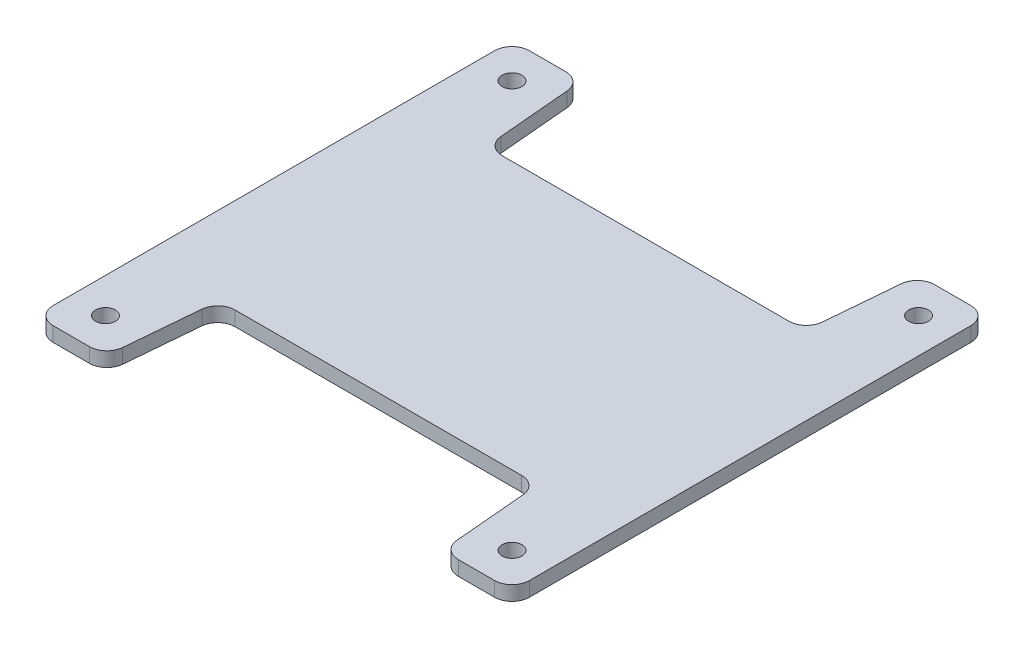
ISO-10303-21;
HEADER;
FILE_DESCRIPTION(('STEP AP214'),'2;1');
FILE_NAME('part.step','',(''),(''),'','','');
FILE_SCHEMA(('AUTOMOTIVE_DESIGN { 1 0 10303 214 1 1 1 1 }'));
ENDSEC;
DATA;
#1=APPLICATION_CONTEXT('core data for automotive mechanical design processes');
#2=APPLICATION_PROTOCOL_DEFINITION('international standard','automotive_design',2000,#1);
#3=PRODUCT_CONTEXT('',#1,'mechanical');
#4=PRODUCT('Part','Part','',(#3));
#5=PRODUCT_RELATED_PRODUCT_CATEGORY('part','',(#4));
#6=PRODUCT_DEFINITION_FORMATION('','',#4);
#7=PRODUCT_DEFINITION_CONTEXT('part definition',#1,'design');
#8=PRODUCT_DEFINITION('design','',#6,#7);
#9=PRODUCT_DEFINITION_SHAPE('','',#8);
#10=(LENGTH_UNIT() NAMED_UNIT(*) SI_UNIT(.MILLI.,.METRE.));
#11=(NAMED_UNIT(*) PLANE_ANGLE_UNIT() SI_UNIT($,.RADIAN.));
#12=(NAMED_UNIT(*) SI_UNIT($,.STERADIAN.) SOLID_ANGLE_UNIT());
#13=UNCERTAINTY_MEASURE_WITH_UNIT(LENGTH_MEASURE(1.E-05),#10,'distance_accuracy_value','');
#14=(GEOMETRIC_REPRESENTATION_CONTEXT(3) GLOBAL_UNCERTAINTY_ASSIGNED_CONTEXT((#13)) GLOBAL_UNIT_ASSIGNED_CONTEXT((#10,
#11,#12)) REPRESENTATION_CONTEXT('',''));
#15=CARTESIAN_POINT('',(0.,0.,0.));
#16=DIRECTION('',(0.,0.,1.));
#17=DIRECTION('',(1.,0.,0.));
#18=AXIS2_PLACEMENT_3D('',#15,#16,#17);
#19=CARTESIAN_POINT('',(-41.,1.25,41.));
#20=DIRECTION('',(0.,0.,-1.));
#21=DIRECTION('',(-1.,0.,0.));
#22=AXIS2_PLACEMENT_3D('',#19,#20,#21);
#23=PLANE('',#22);
#24=DIRECTION('',(1.,0.,0.));
#25=VECTOR('',#24,1.);
#26=CARTESIAN_POINT('',(-41.,1.25,41.));
#27=LINE('',#26,#25);
#28=CARTESIAN_POINT('',(31.7489935220523,1.25,41.));
#29=VERTEX_POINT('',#28);
#30=CARTESIAN_POINT('',(38.,1.25,41.));
#31=VERTEX_POINT('',#30);
#32=EDGE_CURVE('E458',#29,#31,#27,.T.);
#33=ORIENTED_EDGE('',*,*,#32,.F.);
#34=DIRECTION('',(0.,-1.,0.));
#35=VECTOR('',#34,1.);
#36=CARTESIAN_POINT('',(31.7489935220523,-1.25,41.));
#37=LINE('',#36,#35);
#38=CARTESIAN_POINT('',(31.7489935220523,-1.25,41.));
#39=VERTEX_POINT('',#38);
#40=EDGE_CURVE('E337',#29,#39,#37,.T.);
#41=ORIENTED_EDGE('',*,*,#40,.T.);
#42=DIRECTION('',(1.,0.,0.));
#43=VECTOR('',#42,1.);
#44=CARTESIAN_POINT('',(-41.,-1.25,41.));
#45=LINE('',#44,#43);
#46=CARTESIAN_POINT('',(38.,-1.25,41.));
#47=VERTEX_POINT('',#46);
#48=EDGE_CURVE('E469',#39,#47,#45,.T.);
#49=ORIENTED_EDGE('',*,*,#48,.T.);
#50=DIRECTION('',(0.,-1.,0.));
#51=VECTOR('',#50,1.);
#52=CARTESIAN_POINT('',(38.,1.25,41.));
#53=LINE('',#52,#51);
#54=EDGE_CURVE('E334',#47,#31,#53,.F.);
#55=ORIENTED_EDGE('',*,*,#54,.T.);
#56=EDGE_LOOP('',(#33,#41,#49,#55));
#57=FACE_BOUND('',#56,.T.);
#58=ADVANCED_FACE('F43',(#57),#23,.F.);
#59=CARTESIAN_POINT('',(-41.,1.25,-41.));
#60=DIRECTION('',(0.,0.,1.));
#61=DIRECTION('',(1.,0.,0.));
#62=AXIS2_PLACEMENT_3D('',#59,#60,#61);
#63=PLANE('',#62);
#64=DIRECTION('',(-1.,0.,0.));
#65=VECTOR('',#64,1.);
#66=CARTESIAN_POINT('',(-41.,1.25,-41.));
#67=LINE('',#66,#65);
#68=CARTESIAN_POINT('',(-31.7489935220523,1.25,-41.));
#69=VERTEX_POINT('',#68);
#70=CARTESIAN_POINT('',(-38.,1.25,-41.));
#71=VERTEX_POINT('',#70);
#72=EDGE_CURVE('E240',#69,#71,#67,.T.);
#73=ORIENTED_EDGE('',*,*,#72,.F.);
#74=DIRECTION('',(0.,-1.,0.));
#75=VECTOR('',#74,1.);
#76=CARTESIAN_POINT('',(-31.7489935220523,-1.25,-41.));
#77=LINE('',#76,#75);
#78=CARTESIAN_POINT('',(-31.7489935220523,-1.25,-41.));
#79=VERTEX_POINT('',#78);
#80=EDGE_CURVE('E255',#69,#79,#77,.T.);
#81=ORIENTED_EDGE('',*,*,#80,.T.);
#82=DIRECTION('',(-1.,0.,0.));
#83=VECTOR('',#82,1.);
#84=CARTESIAN_POINT('',(-41.,-1.25,-41.));
#85=LINE('',#84,#83);
#86=CARTESIAN_POINT('',(-38.,-1.25,-41.));
#87=VERTEX_POINT('',#86);
#88=EDGE_CURVE('E476',#79,#87,#85,.T.);
#89=ORIENTED_EDGE('',*,*,#88,.T.);
#90=DIRECTION('',(0.,-1.,0.));
#91=VECTOR('',#90,1.);
#92=CARTESIAN_POINT('',(-38.,1.25,-41.));
#93=LINE('',#92,#91);
#94=EDGE_CURVE('E252',#87,#71,#93,.F.);
#95=ORIENTED_EDGE('',*,*,#94,.T.);
#96=EDGE_LOOP('',(#73,#81,#89,#95));
#97=FACE_BOUND('',#96,.T.);
#98=ADVANCED_FACE('F530',(#97),#63,.F.);
#99=CARTESIAN_POINT('',(0.,1.25,0.));
#100=DIRECTION('',(0.,1.,0.));
#101=DIRECTION('',(0.,0.,1.));
#102=AXIS2_PLACEMENT_3D('',#99,#100,#101);
#103=PLANE('',#102);
#104=CARTESIAN_POINT('',(35.,1.25,-35.));
#105=DIRECTION('',(0.,1.,0.));
#106=DIRECTION('',(0.,0.,1.));
#107=AXIS2_PLACEMENT_3D('',#104,#105,#106);
#108=CIRCLE('',#107,1.69999999999999);
#109=CARTESIAN_POINT('',(35.,1.25,-33.3));
#110=VERTEX_POINT('',#109);
#111=EDGE_CURVE('E421',#110,#110,#108,.T.);
#112=ORIENTED_EDGE('',*,*,#111,.F.);
#113=EDGE_LOOP('',(#112));
#114=FACE_BOUND('',#113,.T.);
#115=CARTESIAN_POINT('',(-35.,1.25,35.));
#116=DIRECTION('',(0.,1.,0.));
#117=DIRECTION('',(0.,0.,1.));
#118=AXIS2_PLACEMENT_3D('',#115,#116,#117);
#119=CIRCLE('',#118,1.69999999999999);
#120=CARTESIAN_POINT('',(-35.,1.25,36.7));
#121=VERTEX_POINT('',#120);
#122=EDGE_CURVE('E430',#121,#121,#119,.T.);
#123=ORIENTED_EDGE('',*,*,#122,.F.);
#124=EDGE_LOOP('',(#123));
#125=FACE_BOUND('',#124,.T.);
#126=CARTESIAN_POINT('',(-35.,1.25,-35.));
#127=DIRECTION('',(0.,1.,0.));
#128=DIRECTION('',(0.,0.,1.));
#129=AXIS2_PLACEMENT_3D('',#126,#127,#128);
#130=CIRCLE('',#129,1.69999999999999);
#131=CARTESIAN_POINT('',(-35.,1.25,-33.3));
#132=VERTEX_POINT('',#131);
#133=EDGE_CURVE('E438',#132,#132,#130,.T.);
#134=ORIENTED_EDGE('',*,*,#133,.F.);
#135=EDGE_LOOP('',(#134));
#136=FACE_BOUND('',#135,.T.);
#137=CARTESIAN_POINT('',(35.,1.25,35.));
#138=DIRECTION('',(0.,1.,0.));
#139=DIRECTION('',(0.,0.,1.));
#140=AXIS2_PLACEMENT_3D('',#137,#138,#139);
#141=CIRCLE('',#140,1.69999999999999);
#142=CARTESIAN_POINT('',(35.,1.25,36.7));
#143=VERTEX_POINT('',#142);
#144=EDGE_CURVE('E446',#143,#143,#141,.T.);
#145=ORIENTED_EDGE('',*,*,#144,.F.);
#146=EDGE_LOOP('',(#145));
#147=FACE_BOUND('',#146,.T.);
#148=DIRECTION('',(0.0871557427476557,0.,0.996194698091746));
#149=VECTOR('',#148,1.);
#150=CARTESIAN_POINT('',(-25.2199247765051,1.25,2.2064575129207));
#151=LINE('',#150,#149);
#152=CARTESIAN_POINT('',(-28.7604094277771,1.25,-38.261467228243));
#153=VERTEX_POINT('',#152);
#154=CARTESIAN_POINT('',(-27.6647946287564,1.25,-25.738532771757));
#155=VERTEX_POINT('',#154);
#156=EDGE_CURVE('E416',#153,#155,#151,.T.);
#157=ORIENTED_EDGE('',*,*,#156,.F.);
#158=CARTESIAN_POINT('',(-31.7489935220523,1.25,-38.));
#159=DIRECTION('',(0.,1.,0.));
#160=DIRECTION('',(0.,0.,1.));
#161=AXIS2_PLACEMENT_3D('',#158,#159,#160);
#162=CIRCLE('',#161,3.);
#163=EDGE_CURVE('E310',#153,#69,#162,.T.);
#164=ORIENTED_EDGE('',*,*,#163,.T.);
#165=ORIENTED_EDGE('',*,*,#72,.T.);
#166=CARTESIAN_POINT('',(-38.,1.25,-38.));
#167=DIRECTION('',(0.,1.,0.));
#168=DIRECTION('',(0.,0.,1.));
#169=AXIS2_PLACEMENT_3D('',#166,#167,#168);
#170=CIRCLE('',#169,3.);
#171=CARTESIAN_POINT('',(-41.,1.25,-38.));
#172=VERTEX_POINT('',#171);
#173=EDGE_CURVE('E295',#71,#172,#170,.T.);
#174=ORIENTED_EDGE('',*,*,#173,.T.);
#175=DIRECTION('',(0.,0.,1.));
#176=VECTOR('',#175,1.);
#177=CARTESIAN_POINT('',(-41.,1.25,-41.));
#178=LINE('',#177,#176);
#179=CARTESIAN_POINT('',(-41.,1.25,38.));
#180=VERTEX_POINT('',#179);
#181=EDGE_CURVE('E455',#172,#180,#178,.T.);
#182=ORIENTED_EDGE('',*,*,#181,.T.);
#183=CARTESIAN_POINT('',(-38.,1.25,38.));
#184=DIRECTION('',(0.,1.,0.));
#185=DIRECTION('',(0.,0.,1.));
#186=AXIS2_PLACEMENT_3D('',#183,#184,#185);
#187=CIRCLE('',#186,3.);
#188=CARTESIAN_POINT('',(-38.,1.25,41.));
#189=VERTEX_POINT('',#188);
#190=EDGE_CURVE('E66',#180,#189,#187,.T.);
#191=ORIENTED_EDGE('',*,*,#190,.T.);
#192=CARTESIAN_POINT('',(-31.7489935220523,1.25,41.));
#193=VERTEX_POINT('',#192);
#194=EDGE_CURVE('E459',#189,#193,#27,.T.);
#195=ORIENTED_EDGE('',*,*,#194,.T.);
#196=CARTESIAN_POINT('',(-31.7489935220523,1.25,38.));
#197=DIRECTION('',(0.,1.,0.));
#198=DIRECTION('',(0.,0.,1.));
#199=AXIS2_PLACEMENT_3D('',#196,#197,#198);
#200=CIRCLE('',#199,3.);
#201=CARTESIAN_POINT('',(-28.7604094277771,1.25,38.261467228243));
#202=VERTEX_POINT('',#201);
#203=EDGE_CURVE('E301',#193,#202,#200,.T.);
#204=ORIENTED_EDGE('',*,*,#203,.T.);
#205=DIRECTION('',(0.0871557427476557,0.,-0.996194698091746));
#206=VECTOR('',#205,1.);
#207=CARTESIAN_POINT('',(-25.2199247765051,1.25,-2.2064575129207));
#208=LINE('',#207,#206);
#209=CARTESIAN_POINT('',(-27.6647946287564,1.25,25.738532771757));
#210=VERTEX_POINT('',#209);
#211=EDGE_CURVE('E492',#202,#210,#208,.T.);
#212=ORIENTED_EDGE('',*,*,#211,.T.);
#213=CARTESIAN_POINT('',(-24.6762105344812,1.25,26.));
#214=DIRECTION('',(0.,1.,0.));
#215=DIRECTION('',(0.,0.,1.));
#216=AXIS2_PLACEMENT_3D('',#213,#214,#215);
#217=CIRCLE('',#216,3.);
#218=CARTESIAN_POINT('',(-24.6762105344812,1.25,23.));
#219=VERTEX_POINT('',#218);
#220=EDGE_CURVE('E370',#210,#219,#217,.F.);
#221=ORIENTED_EDGE('',*,*,#220,.T.);
#222=DIRECTION('',(-1.,0.,0.));
#223=VECTOR('',#222,1.);
#224=CARTESIAN_POINT('',(0.,1.25,23.));
#225=LINE('',#224,#223);
#226=CARTESIAN_POINT('',(24.6762105344812,1.25,23.));
#227=VERTEX_POINT('',#226);
#228=EDGE_CURVE('E426',#227,#219,#225,.T.);
#229=ORIENTED_EDGE('',*,*,#228,.F.);
#230=CARTESIAN_POINT('',(24.6762105344812,1.25,26.));
#231=DIRECTION('',(0.,1.,0.));
#232=DIRECTION('',(0.,0.,1.));
#233=AXIS2_PLACEMENT_3D('',#230,#231,#232);
#234=CIRCLE('',#233,3.);
#235=CARTESIAN_POINT('',(27.6647946287564,1.25,25.738532771757));
#236=VERTEX_POINT('',#235);
#237=EDGE_CURVE('E11',#227,#236,#234,.F.);
#238=ORIENTED_EDGE('',*,*,#237,.T.);
#239=DIRECTION('',(-0.0871557427476557,0.,-0.996194698091746));
#240=VECTOR('',#239,1.);
#241=CARTESIAN_POINT('',(25.2199247765051,1.25,-2.2064575129207));
#242=LINE('',#241,#240);
#243=CARTESIAN_POINT('',(28.7604094277771,1.25,38.261467228243));
#244=VERTEX_POINT('',#243);
#245=EDGE_CURVE('E227',#244,#236,#242,.T.);
#246=ORIENTED_EDGE('',*,*,#245,.F.);
#247=CARTESIAN_POINT('',(31.7489935220523,1.25,38.));
#248=DIRECTION('',(0.,1.,0.));
#249=DIRECTION('',(0.,0.,1.));
#250=AXIS2_PLACEMENT_3D('',#247,#248,#249);
#251=CIRCLE('',#250,3.);
#252=EDGE_CURVE('E304',#244,#29,#251,.T.);
#253=ORIENTED_EDGE('',*,*,#252,.T.);
#254=ORIENTED_EDGE('',*,*,#32,.T.);
#255=CARTESIAN_POINT('',(38.,1.25,38.));
#256=DIRECTION('',(0.,1.,0.));
#257=DIRECTION('',(0.,0.,1.));
#258=AXIS2_PLACEMENT_3D('',#255,#256,#257);
#259=CIRCLE('',#258,3.);
#260=CARTESIAN_POINT('',(41.,1.25,38.));
#261=VERTEX_POINT('',#260);
#262=EDGE_CURVE('E290',#31,#261,#259,.T.);
#263=ORIENTED_EDGE('',*,*,#262,.T.);
#264=DIRECTION('',(0.,0.,-1.));
#265=VECTOR('',#264,1.);
#266=CARTESIAN_POINT('',(41.,1.25,-41.));
#267=LINE('',#266,#265);
#268=CARTESIAN_POINT('',(41.,1.25,-38.));
#269=VERTEX_POINT('',#268);
#270=EDGE_CURVE('E462',#261,#269,#267,.T.);
#271=ORIENTED_EDGE('',*,*,#270,.T.);
#272=CARTESIAN_POINT('',(38.,1.25,-38.));
#273=DIRECTION('',(0.,1.,0.));
#274=DIRECTION('',(0.,0.,1.));
#275=AXIS2_PLACEMENT_3D('',#272,#273,#274);
#276=CIRCLE('',#275,3.);
#277=CARTESIAN_POINT('',(38.,1.25,-41.));
#278=VERTEX_POINT('',#277);
#279=EDGE_CURVE('E298',#269,#278,#276,.T.);
#280=ORIENTED_EDGE('',*,*,#279,.T.);
#281=CARTESIAN_POINT('',(31.7489935220523,1.25,-41.));
#282=VERTEX_POINT('',#281);
#283=EDGE_CURVE('E233',#278,#282,#67,.T.);
#284=ORIENTED_EDGE('',*,*,#283,.T.);
#285=CARTESIAN_POINT('',(31.7489935220523,1.25,-38.));
#286=DIRECTION('',(0.,1.,0.));
#287=DIRECTION('',(0.,0.,1.));
#288=AXIS2_PLACEMENT_3D('',#285,#286,#287);
#289=CIRCLE('',#288,3.);
#290=CARTESIAN_POINT('',(28.7604094277771,1.25,-38.261467228243));
#291=VERTEX_POINT('',#290);
#292=EDGE_CURVE('E307',#282,#291,#289,.T.);
#293=ORIENTED_EDGE('',*,*,#292,.T.);
#294=DIRECTION('',(-0.0871557427476557,0.,0.996194698091746));
#295=VECTOR('',#294,1.);
#296=CARTESIAN_POINT('',(25.2199247765051,1.25,2.2064575129207));
#297=LINE('',#296,#295);
#298=CARTESIAN_POINT('',(27.6647946287564,1.25,-25.738532771757));
#299=VERTEX_POINT('',#298);
#300=EDGE_CURVE('E392',#291,#299,#297,.T.);
#301=ORIENTED_EDGE('',*,*,#300,.T.);
#302=CARTESIAN_POINT('',(24.6762105344812,1.25,-26.));
#303=DIRECTION('',(0.,1.,0.));
#304=DIRECTION('',(0.,0.,1.));
#305=AXIS2_PLACEMENT_3D('',#302,#303,#304);
#306=CIRCLE('',#305,3.);
#307=CARTESIAN_POINT('',(24.6762105344812,1.25,-23.));
#308=VERTEX_POINT('',#307);
#309=EDGE_CURVE('E217',#299,#308,#306,.F.);
#310=ORIENTED_EDGE('',*,*,#309,.T.);
#311=DIRECTION('',(-1.,0.,0.));
#312=VECTOR('',#311,1.);
#313=CARTESIAN_POINT('',(0.,1.25,-23.));
#314=LINE('',#313,#312);
#315=CARTESIAN_POINT('',(-24.6762105344812,1.25,-23.));
#316=VERTEX_POINT('',#315);
#317=EDGE_CURVE('E389',#308,#316,#314,.T.);
#318=ORIENTED_EDGE('',*,*,#317,.T.);
#319=CARTESIAN_POINT('',(-24.6762105344812,1.25,-26.));
#320=DIRECTION('',(0.,1.,0.));
#321=DIRECTION('',(0.,0.,1.));
#322=AXIS2_PLACEMENT_3D('',#319,#320,#321);
#323=CIRCLE('',#322,3.);
#324=EDGE_CURVE('E376',#316,#155,#323,.F.);
#325=ORIENTED_EDGE('',*,*,#324,.T.);
#326=EDGE_LOOP('',(#157,#164,#165,#174,#182,#191,#195,#204,#212,#221,#229,#238,#246,#253,#254,
#263,#271,#280,#284,#293,#301,#310,#318,#325));
#327=FACE_BOUND('',#326,.T.);
#328=ADVANCED_FACE('F388',(#114,#125,#136,#147,#327),#103,.T.);
#329=CARTESIAN_POINT('',(0.,-1.25,0.));
#330=DIRECTION('',(0.,1.,0.));
#331=DIRECTION('',(0.,0.,1.));
#332=AXIS2_PLACEMENT_3D('',#329,#330,#331);
#333=PLANE('',#332);
#334=CARTESIAN_POINT('',(35.,-1.25,-35.));
#335=DIRECTION('',(0.,1.,0.));
#336=DIRECTION('',(0.,0.,1.));
#337=AXIS2_PLACEMENT_3D('',#334,#335,#336);
#338=CIRCLE('',#337,1.69999999999999);
#339=CARTESIAN_POINT('',(35.,-1.25,-33.3));
#340=VERTEX_POINT('',#339);
#341=EDGE_CURVE('E425',#340,#340,#338,.T.);
#342=ORIENTED_EDGE('',*,*,#341,.T.);
#343=EDGE_LOOP('',(#342));
#344=FACE_BOUND('',#343,.T.);
#345=CARTESIAN_POINT('',(-35.,-1.25,35.));
#346=DIRECTION('',(0.,1.,0.));
#347=DIRECTION('',(0.,0.,1.));
#348=AXIS2_PLACEMENT_3D('',#345,#346,#347);
#349=CIRCLE('',#348,1.69999999999999);
#350=CARTESIAN_POINT('',(-35.,-1.25,36.7));
#351=VERTEX_POINT('',#350);
#352=EDGE_CURVE('E434',#351,#351,#349,.T.);
#353=ORIENTED_EDGE('',*,*,#352,.T.);
#354=EDGE_LOOP('',(#353));
#355=FACE_BOUND('',#354,.T.);
#356=CARTESIAN_POINT('',(-35.,-1.25,-35.));
#357=DIRECTION('',(0.,1.,0.));
#358=DIRECTION('',(0.,0.,1.));
#359=AXIS2_PLACEMENT_3D('',#356,#357,#358);
#360=CIRCLE('',#359,1.69999999999999);
#361=CARTESIAN_POINT('',(-35.,-1.25,-33.3));
#362=VERTEX_POINT('',#361);
#363=EDGE_CURVE('E442',#362,#362,#360,.T.);
#364=ORIENTED_EDGE('',*,*,#363,.T.);
#365=EDGE_LOOP('',(#364));
#366=FACE_BOUND('',#365,.T.);
#367=CARTESIAN_POINT('',(35.,-1.25,35.));
#368=DIRECTION('',(0.,1.,0.));
#369=DIRECTION('',(0.,0.,1.));
#370=AXIS2_PLACEMENT_3D('',#367,#368,#369);
#371=CIRCLE('',#370,1.69999999999999);
#372=CARTESIAN_POINT('',(35.,-1.25,36.7));
#373=VERTEX_POINT('',#372);
#374=EDGE_CURVE('E450',#373,#373,#371,.T.);
#375=ORIENTED_EDGE('',*,*,#374,.T.);
#376=EDGE_LOOP('',(#375));
#377=FACE_BOUND('',#376,.T.);
#378=ORIENTED_EDGE('',*,*,#88,.F.);
#379=CARTESIAN_POINT('',(-31.7489935220523,-1.25,-38.));
#380=DIRECTION('',(0.,1.,0.));
#381=DIRECTION('',(0.,0.,1.));
#382=AXIS2_PLACEMENT_3D('',#379,#380,#381);
#383=CIRCLE('',#382,3.);
#384=CARTESIAN_POINT('',(-28.7604094277771,-1.25,-38.261467228243));
#385=VERTEX_POINT('',#384);
#386=EDGE_CURVE('E280',#79,#385,#383,.F.);
#387=ORIENTED_EDGE('',*,*,#386,.T.);
#388=DIRECTION('',(0.0871557427476557,0.,0.996194698091746));
#389=VECTOR('',#388,1.);
#390=CARTESIAN_POINT('',(-25.2199247765051,-1.25,2.2064575129207));
#391=LINE('',#390,#389);
#392=CARTESIAN_POINT('',(-27.6647946287564,-1.25,-25.738532771757));
#393=VERTEX_POINT('',#392);
#394=EDGE_CURVE('E412',#385,#393,#391,.T.);
#395=ORIENTED_EDGE('',*,*,#394,.T.);
#396=CARTESIAN_POINT('',(-24.6762105344812,-1.25,-26.));
#397=DIRECTION('',(0.,1.,0.));
#398=DIRECTION('',(0.,0.,1.));
#399=AXIS2_PLACEMENT_3D('',#396,#397,#398);
#400=CIRCLE('',#399,3.);
#401=CARTESIAN_POINT('',(-24.6762105344812,-1.25,-23.));
#402=VERTEX_POINT('',#401);
#403=EDGE_CURVE('E373',#393,#402,#400,.T.);
#404=ORIENTED_EDGE('',*,*,#403,.T.);
#405=DIRECTION('',(-1.,0.,0.));
#406=VECTOR('',#405,1.);
#407=CARTESIAN_POINT('',(0.,-1.25,-23.));
#408=LINE('',#407,#406);
#409=CARTESIAN_POINT('',(24.6762105344812,-1.25,-23.));
#410=VERTEX_POINT('',#409);
#411=EDGE_CURVE('E407',#410,#402,#408,.T.);
#412=ORIENTED_EDGE('',*,*,#411,.F.);
#413=CARTESIAN_POINT('',(24.6762105344812,-1.25,-26.));
#414=DIRECTION('',(0.,1.,0.));
#415=DIRECTION('',(0.,0.,1.));
#416=AXIS2_PLACEMENT_3D('',#413,#414,#415);
#417=CIRCLE('',#416,3.);
#418=CARTESIAN_POINT('',(27.6647946287564,-1.25,-25.738532771757));
#419=VERTEX_POINT('',#418);
#420=EDGE_CURVE('E379',#410,#419,#417,.T.);
#421=ORIENTED_EDGE('',*,*,#420,.T.);
#422=DIRECTION('',(-0.0871557427476557,0.,0.996194698091746));
#423=VECTOR('',#422,1.);
#424=CARTESIAN_POINT('',(25.2199247765051,-1.25,2.2064575129207));
#425=LINE('',#424,#423);
#426=CARTESIAN_POINT('',(28.7604094277771,-1.25,-38.261467228243));
#427=VERTEX_POINT('',#426);
#428=EDGE_CURVE('E406',#427,#419,#425,.T.);
#429=ORIENTED_EDGE('',*,*,#428,.F.);
#430=CARTESIAN_POINT('',(31.7489935220523,-1.25,-38.));
#431=DIRECTION('',(0.,1.,0.));
#432=DIRECTION('',(0.,0.,1.));
#433=AXIS2_PLACEMENT_3D('',#430,#431,#432);
#434=CIRCLE('',#433,3.);
#435=CARTESIAN_POINT('',(31.7489935220523,-1.25,-41.));
#436=VERTEX_POINT('',#435);
#437=EDGE_CURVE('E277',#427,#436,#434,.F.);
#438=ORIENTED_EDGE('',*,*,#437,.T.);
#439=CARTESIAN_POINT('',(38.,-1.25,-41.));
#440=VERTEX_POINT('',#439);
#441=EDGE_CURVE('E243',#440,#436,#85,.T.);
#442=ORIENTED_EDGE('',*,*,#441,.F.);
#443=CARTESIAN_POINT('',(38.,-1.25,-38.));
#444=DIRECTION('',(0.,1.,0.));
#445=DIRECTION('',(0.,0.,1.));
#446=AXIS2_PLACEMENT_3D('',#443,#444,#445);
#447=CIRCLE('',#446,3.);
#448=CARTESIAN_POINT('',(41.,-1.25,-38.));
#449=VERTEX_POINT('',#448);
#450=EDGE_CURVE('E268',#440,#449,#447,.F.);
#451=ORIENTED_EDGE('',*,*,#450,.T.);
#452=DIRECTION('',(0.,0.,-1.));
#453=VECTOR('',#452,1.);
#454=CARTESIAN_POINT('',(41.,-1.25,-41.));
#455=LINE('',#454,#453);
#456=CARTESIAN_POINT('',(41.,-1.25,38.));
#457=VERTEX_POINT('',#456);
#458=EDGE_CURVE('E473',#457,#449,#455,.T.);
#459=ORIENTED_EDGE('',*,*,#458,.F.);
#460=CARTESIAN_POINT('',(38.,-1.25,38.));
#461=DIRECTION('',(0.,1.,0.));
#462=DIRECTION('',(0.,0.,1.));
#463=AXIS2_PLACEMENT_3D('',#460,#461,#462);
#464=CIRCLE('',#463,3.);
#465=EDGE_CURVE('E259',#457,#47,#464,.F.);
#466=ORIENTED_EDGE('',*,*,#465,.T.);
#467=ORIENTED_EDGE('',*,*,#48,.F.);
#468=CARTESIAN_POINT('',(31.7489935220523,-1.25,38.));
#469=DIRECTION('',(0.,1.,0.));
#470=DIRECTION('',(0.,0.,1.));
#471=AXIS2_PLACEMENT_3D('',#468,#469,#470);
#472=CIRCLE('',#471,3.);
#473=CARTESIAN_POINT('',(28.7604094277771,-1.25,38.261467228243));
#474=VERTEX_POINT('',#473);
#475=EDGE_CURVE('E274',#39,#474,#472,.F.);
#476=ORIENTED_EDGE('',*,*,#475,.T.);
#477=DIRECTION('',(-0.0871557427476557,0.,-0.996194698091746));
#478=VECTOR('',#477,1.);
#479=CARTESIAN_POINT('',(25.2199247765051,-1.25,-2.2064575129207));
#480=LINE('',#479,#478);
#481=CARTESIAN_POINT('',(27.6647946287564,-1.25,25.738532771757));
#482=VERTEX_POINT('',#481);
#483=EDGE_CURVE('E211',#474,#482,#480,.T.);
#484=ORIENTED_EDGE('',*,*,#483,.T.);
#485=CARTESIAN_POINT('',(24.6762105344812,-1.25,26.));
#486=DIRECTION('',(0.,1.,0.));
#487=DIRECTION('',(0.,0.,1.));
#488=AXIS2_PLACEMENT_3D('',#485,#486,#487);
#489=CIRCLE('',#488,3.);
#490=CARTESIAN_POINT('',(24.6762105344812,-1.25,23.));
#491=VERTEX_POINT('',#490);
#492=EDGE_CURVE('E52',#482,#491,#489,.T.);
#493=ORIENTED_EDGE('',*,*,#492,.T.);
#494=DIRECTION('',(-1.,0.,0.));
#495=VECTOR('',#494,1.);
#496=CARTESIAN_POINT('',(0.,-1.25,23.));
#497=LINE('',#496,#495);
#498=CARTESIAN_POINT('',(-24.6762105344812,-1.25,23.));
#499=VERTEX_POINT('',#498);
#500=EDGE_CURVE('E209',#491,#499,#497,.T.);
#501=ORIENTED_EDGE('',*,*,#500,.T.);
#502=CARTESIAN_POINT('',(-24.6762105344812,-1.25,26.));
#503=DIRECTION('',(0.,1.,0.));
#504=DIRECTION('',(0.,0.,1.));
#505=AXIS2_PLACEMENT_3D('',#502,#503,#504);
#506=CIRCLE('',#505,3.);
#507=CARTESIAN_POINT('',(-27.6647946287564,-1.25,25.738532771757));
#508=VERTEX_POINT('',#507);
#509=EDGE_CURVE('E367',#499,#508,#506,.T.);
#510=ORIENTED_EDGE('',*,*,#509,.T.);
#511=DIRECTION('',(0.0871557427476557,0.,-0.996194698091746));
#512=VECTOR('',#511,1.);
#513=CARTESIAN_POINT('',(-25.2199247765051,-1.25,-2.2064575129207));
#514=LINE('',#513,#512);
#515=CARTESIAN_POINT('',(-28.7604094277771,-1.25,38.261467228243));
#516=VERTEX_POINT('',#515);
#517=EDGE_CURVE('E228',#516,#508,#514,.T.);
#518=ORIENTED_EDGE('',*,*,#517,.F.);
#519=CARTESIAN_POINT('',(-31.7489935220523,-1.25,38.));
#520=DIRECTION('',(0.,1.,0.));
#521=DIRECTION('',(0.,0.,1.));
#522=AXIS2_PLACEMENT_3D('',#519,#520,#521);
#523=CIRCLE('',#522,3.);
#524=CARTESIAN_POINT('',(-31.7489935220523,-1.25,41.));
#525=VERTEX_POINT('',#524);
#526=EDGE_CURVE('E271',#516,#525,#523,.F.);
#527=ORIENTED_EDGE('',*,*,#526,.T.);
#528=CARTESIAN_POINT('',(-38.,-1.25,41.));
#529=VERTEX_POINT('',#528);
#530=EDGE_CURVE('E472',#529,#525,#45,.T.);
#531=ORIENTED_EDGE('',*,*,#530,.F.);
#532=CARTESIAN_POINT('',(-38.,-1.25,38.));
#533=DIRECTION('',(0.,1.,0.));
#534=DIRECTION('',(0.,0.,1.));
#535=AXIS2_PLACEMENT_3D('',#532,#533,#534);
#536=CIRCLE('',#535,3.);
#537=CARTESIAN_POINT('',(-41.,-1.25,38.));
#538=VERTEX_POINT('',#537);
#539=EDGE_CURVE('E262',#529,#538,#536,.F.);
#540=ORIENTED_EDGE('',*,*,#539,.T.);
#541=DIRECTION('',(0.,0.,1.));
#542=VECTOR('',#541,1.);
#543=CARTESIAN_POINT('',(-41.,-1.25,-41.));
#544=LINE('',#543,#542);
#545=CARTESIAN_POINT('',(-41.,-1.25,-38.));
#546=VERTEX_POINT('',#545);
#547=EDGE_CURVE('E454',#546,#538,#544,.T.);
#548=ORIENTED_EDGE('',*,*,#547,.F.);
#549=CARTESIAN_POINT('',(-38.,-1.25,-38.));
#550=DIRECTION('',(0.,1.,0.));
#551=DIRECTION('',(0.,0.,1.));
#552=AXIS2_PLACEMENT_3D('',#549,#550,#551);
#553=CIRCLE('',#552,3.);
#554=EDGE_CURVE('E265',#546,#87,#553,.F.);
#555=ORIENTED_EDGE('',*,*,#554,.T.);
#556=EDGE_LOOP('',(#378,#387,#395,#404,#412,#421,#429,#438,#442,#451,#459,#466,#467,#476,#484,
#493,#501,#510,#518,#527,#531,#540,#548,#555));
#557=FACE_BOUND('',#556,.T.);
#558=ADVANCED_FACE('F208',(#344,#355,#366,#377,#557),#333,.F.);
#559=CARTESIAN_POINT('',(-41.,1.25,-41.));
#560=DIRECTION('',(1.,0.,0.));
#561=DIRECTION('',(0.,0.,-1.));
#562=AXIS2_PLACEMENT_3D('',#559,#560,#561);
#563=PLANE('',#562);
#564=ORIENTED_EDGE('',*,*,#181,.F.);
#565=DIRECTION('',(0.,-1.,0.));
#566=VECTOR('',#565,1.);
#567=CARTESIAN_POINT('',(-41.,1.25,-38.));
#568=LINE('',#567,#566);
#569=EDGE_CURVE('E363',#172,#546,#568,.T.);
#570=ORIENTED_EDGE('',*,*,#569,.T.);
#571=ORIENTED_EDGE('',*,*,#547,.T.);
#572=DIRECTION('',(0.,-1.,0.));
#573=VECTOR('',#572,1.);
#574=CARTESIAN_POINT('',(-41.,1.25,38.));
#575=LINE('',#574,#573);
#576=EDGE_CURVE('E360',#538,#180,#575,.F.);
#577=ORIENTED_EDGE('',*,*,#576,.T.);
#578=EDGE_LOOP('',(#564,#570,#571,#577));
#579=FACE_BOUND('',#578,.T.);
#580=ADVANCED_FACE('F567',(#579),#563,.F.);
#581=ORIENTED_EDGE('',*,*,#530,.T.);
#582=DIRECTION('',(0.,-1.,0.));
#583=VECTOR('',#582,1.);
#584=CARTESIAN_POINT('',(-31.7489935220523,1.25,41.));
#585=LINE('',#584,#583);
#586=EDGE_CURVE('E59',#525,#193,#585,.F.);
#587=ORIENTED_EDGE('',*,*,#586,.T.);
#588=ORIENTED_EDGE('',*,*,#194,.F.);
#589=DIRECTION('',(0.,-1.,0.));
#590=VECTOR('',#589,1.);
#591=CARTESIAN_POINT('',(-38.,1.25,41.));
#592=LINE('',#591,#590);
#593=EDGE_CURVE('E347',#189,#529,#592,.T.);
#594=ORIENTED_EDGE('',*,*,#593,.T.);
#595=EDGE_LOOP('',(#581,#587,#588,#594));
#596=FACE_BOUND('',#595,.T.);
#597=ADVANCED_FACE('F484',(#596),#23,.F.);
#598=CARTESIAN_POINT('',(41.,1.25,-41.));
#599=DIRECTION('',(-1.,0.,0.));
#600=DIRECTION('',(0.,0.,1.));
#601=AXIS2_PLACEMENT_3D('',#598,#599,#600);
#602=PLANE('',#601);
#603=ORIENTED_EDGE('',*,*,#458,.T.);
#604=DIRECTION('',(0.,-1.,0.));
#605=VECTOR('',#604,1.);
#606=CARTESIAN_POINT('',(41.,1.25,-38.));
#607=LINE('',#606,#605);
#608=EDGE_CURVE('E357',#449,#269,#607,.F.);
#609=ORIENTED_EDGE('',*,*,#608,.T.);
#610=ORIENTED_EDGE('',*,*,#270,.F.);
#611=DIRECTION('',(0.,-1.,0.));
#612=VECTOR('',#611,1.);
#613=CARTESIAN_POINT('',(41.,1.25,38.));
#614=LINE('',#613,#612);
#615=EDGE_CURVE('E353',#261,#457,#614,.T.);
#616=ORIENTED_EDGE('',*,*,#615,.T.);
#617=EDGE_LOOP('',(#603,#609,#610,#616));
#618=FACE_BOUND('',#617,.T.);
#619=ADVANCED_FACE('F558',(#618),#602,.F.);
#620=ORIENTED_EDGE('',*,*,#441,.T.);
#621=DIRECTION('',(0.,-1.,0.));
#622=VECTOR('',#621,1.);
#623=CARTESIAN_POINT('',(31.7489935220523,1.25,-41.));
#624=LINE('',#623,#622);
#625=EDGE_CURVE('E331',#436,#282,#624,.F.);
#626=ORIENTED_EDGE('',*,*,#625,.T.);
#627=ORIENTED_EDGE('',*,*,#283,.F.);
#628=DIRECTION('',(0.,-1.,0.));
#629=VECTOR('',#628,1.);
#630=CARTESIAN_POINT('',(38.,1.25,-41.));
#631=LINE('',#630,#629);
#632=EDGE_CURVE('E327',#278,#440,#631,.T.);
#633=ORIENTED_EDGE('',*,*,#632,.T.);
#634=EDGE_LOOP('',(#620,#626,#627,#633));
#635=FACE_BOUND('',#634,.T.);
#636=ADVANCED_FACE('F540',(#635),#63,.F.);
#637=CARTESIAN_POINT('',(35.,1.25,35.));
#638=DIRECTION('',(0.,1.,0.));
#639=DIRECTION('',(0.,0.,1.));
#640=AXIS2_PLACEMENT_3D('',#637,#638,#639);
#641=CYLINDRICAL_SURFACE('',#640,1.69999999999999);
#642=ORIENTED_EDGE('',*,*,#374,.F.);
#643=EDGE_LOOP('',(#642));
#644=FACE_BOUND('',#643,.T.);
#645=ORIENTED_EDGE('',*,*,#144,.T.);
#646=EDGE_LOOP('',(#645));
#647=FACE_BOUND('',#646,.T.);
#648=ADVANCED_FACE('F565',(#644,#647),#641,.F.);
#649=CARTESIAN_POINT('',(-35.,1.25,-35.));
#650=DIRECTION('',(0.,1.,0.));
#651=DIRECTION('',(0.,0.,1.));
#652=AXIS2_PLACEMENT_3D('',#649,#650,#651);
#653=CYLINDRICAL_SURFACE('',#652,1.69999999999999);
#654=ORIENTED_EDGE('',*,*,#363,.F.);
#655=EDGE_LOOP('',(#654));
#656=FACE_BOUND('',#655,.T.);
#657=ORIENTED_EDGE('',*,*,#133,.T.);
#658=EDGE_LOOP('',(#657));
#659=FACE_BOUND('',#658,.T.);
#660=ADVANCED_FACE('F827',(#656,#659),#653,.F.);
#661=CARTESIAN_POINT('',(-35.,1.25,35.));
#662=DIRECTION('',(0.,1.,0.));
#663=DIRECTION('',(0.,0.,1.));
#664=AXIS2_PLACEMENT_3D('',#661,#662,#663);
#665=CYLINDRICAL_SURFACE('',#664,1.69999999999999);
#666=ORIENTED_EDGE('',*,*,#352,.F.);
#667=EDGE_LOOP('',(#666));
#668=FACE_BOUND('',#667,.T.);
#669=ORIENTED_EDGE('',*,*,#122,.T.);
#670=EDGE_LOOP('',(#669));
#671=FACE_BOUND('',#670,.T.);
#672=ADVANCED_FACE('F816',(#668,#671),#665,.F.);
#673=CARTESIAN_POINT('',(35.,1.25,-35.));
#674=DIRECTION('',(0.,1.,0.));
#675=DIRECTION('',(0.,0.,1.));
#676=AXIS2_PLACEMENT_3D('',#673,#674,#675);
#677=CYLINDRICAL_SURFACE('',#676,1.69999999999999);
#678=ORIENTED_EDGE('',*,*,#341,.F.);
#679=EDGE_LOOP('',(#678));
#680=FACE_BOUND('',#679,.T.);
#681=ORIENTED_EDGE('',*,*,#111,.T.);
#682=EDGE_LOOP('',(#681));
#683=FACE_BOUND('',#682,.T.);
#684=ADVANCED_FACE('F746',(#680,#683),#677,.F.);
#685=CARTESIAN_POINT('',(-25.2199247765051,1.25,2.2064575129207));
#686=DIRECTION('',(0.996194698091746,0.,-0.0871557427476557));
#687=DIRECTION('',(-0.0871557427476557,0.,-0.996194698091746));
#688=AXIS2_PLACEMENT_3D('',#685,#686,#687);
#689=PLANE('',#688);
#690=ORIENTED_EDGE('',*,*,#394,.F.);
#691=DIRECTION('',(0.,-1.,0.));
#692=VECTOR('',#691,1.);
#693=CARTESIAN_POINT('',(-28.7604094277771,1.25,-38.261467228243));
#694=LINE('',#693,#692);
#695=EDGE_CURVE('E287',#385,#153,#694,.F.);
#696=ORIENTED_EDGE('',*,*,#695,.T.);
#697=ORIENTED_EDGE('',*,*,#156,.T.);
#698=DIRECTION('',(0.,-1.,0.));
#699=VECTOR('',#698,1.);
#700=CARTESIAN_POINT('',(-27.6647946287564,1.25,-25.738532771757));
#701=LINE('',#700,#699);
#702=EDGE_CURVE('E283',#155,#393,#701,.T.);
#703=ORIENTED_EDGE('',*,*,#702,.T.);
#704=EDGE_LOOP('',(#690,#696,#697,#703));
#705=FACE_BOUND('',#704,.T.);
#706=ADVANCED_FACE('F518',(#705),#689,.T.);
#707=CARTESIAN_POINT('',(0.,1.25,-23.));
#708=DIRECTION('',(0.,0.,1.));
#709=DIRECTION('',(1.,0.,0.));
#710=AXIS2_PLACEMENT_3D('',#707,#708,#709);
#711=PLANE('',#710);
#712=ORIENTED_EDGE('',*,*,#411,.T.);
#713=DIRECTION('',(0.,-1.,0.));
#714=VECTOR('',#713,1.);
#715=CARTESIAN_POINT('',(-24.6762105344812,1.25,-23.));
#716=LINE('',#715,#714);
#717=EDGE_CURVE('E317',#402,#316,#716,.F.);
#718=ORIENTED_EDGE('',*,*,#717,.T.);
#719=ORIENTED_EDGE('',*,*,#317,.F.);
#720=DIRECTION('',(0.,-1.,0.));
#721=VECTOR('',#720,1.);
#722=CARTESIAN_POINT('',(24.6762105344812,-1.25,-23.));
#723=LINE('',#722,#721);
#724=EDGE_CURVE('E313',#308,#410,#723,.T.);
#725=ORIENTED_EDGE('',*,*,#724,.T.);
#726=EDGE_LOOP('',(#712,#718,#719,#725));
#727=FACE_BOUND('',#726,.T.);
#728=ADVANCED_FACE('F398',(#727),#711,.F.);
#729=CARTESIAN_POINT('',(25.2199247765051,1.25,2.2064575129207));
#730=DIRECTION('',(0.996194698091746,0.,0.0871557427476557));
#731=DIRECTION('',(0.0871557427476557,0.,-0.996194698091746));
#732=AXIS2_PLACEMENT_3D('',#729,#730,#731);
#733=PLANE('',#732);
#734=ORIENTED_EDGE('',*,*,#428,.T.);
#735=DIRECTION('',(0.,-1.,0.));
#736=VECTOR('',#735,1.);
#737=CARTESIAN_POINT('',(27.6647946287564,1.25,-25.738532771757));
#738=LINE('',#737,#736);
#739=EDGE_CURVE('E324',#419,#299,#738,.F.);
#740=ORIENTED_EDGE('',*,*,#739,.T.);
#741=ORIENTED_EDGE('',*,*,#300,.F.);
#742=DIRECTION('',(0.,-1.,0.));
#743=VECTOR('',#742,1.);
#744=CARTESIAN_POINT('',(28.7604094277771,1.25,-38.261467228243));
#745=LINE('',#744,#743);
#746=EDGE_CURVE('E320',#291,#427,#745,.T.);
#747=ORIENTED_EDGE('',*,*,#746,.T.);
#748=EDGE_LOOP('',(#734,#740,#741,#747));
#749=FACE_BOUND('',#748,.T.);
#750=ADVANCED_FACE('F409',(#749),#733,.F.);
#751=CARTESIAN_POINT('',(25.2199247765051,1.25,-2.2064575129207));
#752=DIRECTION('',(-0.996194698091746,0.,0.0871557427476557));
#753=DIRECTION('',(0.0871557427476557,0.,0.996194698091746));
#754=AXIS2_PLACEMENT_3D('',#751,#752,#753);
#755=PLANE('',#754);
#756=ORIENTED_EDGE('',*,*,#483,.F.);
#757=DIRECTION('',(0.,-1.,0.));
#758=VECTOR('',#757,1.);
#759=CARTESIAN_POINT('',(28.7604094277771,1.25,38.261467228243));
#760=LINE('',#759,#758);
#761=EDGE_CURVE('E344',#474,#244,#760,.F.);
#762=ORIENTED_EDGE('',*,*,#761,.T.);
#763=ORIENTED_EDGE('',*,*,#245,.T.);
#764=DIRECTION('',(0.,-1.,0.));
#765=VECTOR('',#764,1.);
#766=CARTESIAN_POINT('',(27.6647946287564,-1.25,25.738532771757));
#767=LINE('',#766,#765);
#768=EDGE_CURVE('E341',#236,#482,#767,.T.);
#769=ORIENTED_EDGE('',*,*,#768,.T.);
#770=EDGE_LOOP('',(#756,#762,#763,#769));
#771=FACE_BOUND('',#770,.T.);
#772=ADVANCED_FACE('F708',(#771),#755,.T.);
#773=CARTESIAN_POINT('',(0.,1.25,23.));
#774=DIRECTION('',(0.,0.,1.));
#775=DIRECTION('',(1.,0.,0.));
#776=AXIS2_PLACEMENT_3D('',#773,#774,#775);
#777=PLANE('',#776);
#778=ORIENTED_EDGE('',*,*,#228,.T.);
#779=DIRECTION('',(0.,-1.,0.));
#780=VECTOR('',#779,1.);
#781=CARTESIAN_POINT('',(-24.6762105344812,1.25,23.));
#782=LINE('',#781,#780);
#783=EDGE_CURVE('E225',#219,#499,#782,.T.);
#784=ORIENTED_EDGE('',*,*,#783,.T.);
#785=ORIENTED_EDGE('',*,*,#500,.F.);
#786=DIRECTION('',(0.,-1.,0.));
#787=VECTOR('',#786,1.);
#788=CARTESIAN_POINT('',(24.6762105344812,1.25,23.));
#789=LINE('',#788,#787);
#790=EDGE_CURVE('E222',#491,#227,#789,.F.);
#791=ORIENTED_EDGE('',*,*,#790,.T.);
#792=EDGE_LOOP('',(#778,#784,#785,#791));
#793=FACE_BOUND('',#792,.T.);
#794=ADVANCED_FACE('F221',(#793),#777,.T.);
#795=CARTESIAN_POINT('',(-25.2199247765051,1.25,-2.2064575129207));
#796=DIRECTION('',(-0.996194698091746,0.,-0.0871557427476557));
#797=DIRECTION('',(-0.0871557427476557,0.,0.996194698091746));
#798=AXIS2_PLACEMENT_3D('',#795,#796,#797);
#799=PLANE('',#798);
#800=ORIENTED_EDGE('',*,*,#517,.T.);
#801=DIRECTION('',(0.,-1.,0.));
#802=VECTOR('',#801,1.);
#803=CARTESIAN_POINT('',(-27.6647946287564,1.25,25.738532771757));
#804=LINE('',#803,#802);
#805=EDGE_CURVE('E249',#508,#210,#804,.F.);
#806=ORIENTED_EDGE('',*,*,#805,.T.);
#807=ORIENTED_EDGE('',*,*,#211,.F.);
#808=DIRECTION('',(0.,-1.,0.));
#809=VECTOR('',#808,1.);
#810=CARTESIAN_POINT('',(-28.7604094277771,1.25,38.261467228243));
#811=LINE('',#810,#809);
#812=EDGE_CURVE('E237',#202,#516,#811,.T.);
#813=ORIENTED_EDGE('',*,*,#812,.T.);
#814=EDGE_LOOP('',(#800,#806,#807,#813));
#815=FACE_BOUND('',#814,.T.);
#816=ADVANCED_FACE('F496',(#815),#799,.F.);
#817=CARTESIAN_POINT('',(-24.6762105344812,1.25,26.));
#818=DIRECTION('',(0.,-1.,0.));
#819=DIRECTION('',(0.,0.,-1.));
#820=AXIS2_PLACEMENT_3D('',#817,#818,#819);
#821=CYLINDRICAL_SURFACE('',#820,3.);
#822=ORIENTED_EDGE('',*,*,#220,.F.);
#823=ORIENTED_EDGE('',*,*,#805,.F.);
#824=ORIENTED_EDGE('',*,*,#509,.F.);
#825=ORIENTED_EDGE('',*,*,#783,.F.);
#826=EDGE_LOOP('',(#822,#823,#824,#825));
#827=FACE_BOUND('',#826,.T.);
#828=ADVANCED_FACE('F577',(#827),#821,.F.);
#829=CARTESIAN_POINT('',(-31.7489935220523,1.25,-38.));
#830=DIRECTION('',(0.,1.,0.));
#831=DIRECTION('',(0.,0.,1.));
#832=AXIS2_PLACEMENT_3D('',#829,#830,#831);
#833=CYLINDRICAL_SURFACE('',#832,3.);
#834=ORIENTED_EDGE('',*,*,#163,.F.);
#835=ORIENTED_EDGE('',*,*,#695,.F.);
#836=ORIENTED_EDGE('',*,*,#386,.F.);
#837=ORIENTED_EDGE('',*,*,#80,.F.);
#838=EDGE_LOOP('',(#834,#835,#836,#837));
#839=FACE_BOUND('',#838,.T.);
#840=ADVANCED_FACE('F524',(#839),#833,.T.);
#841=CARTESIAN_POINT('',(-24.6762105344812,1.25,-26.));
#842=DIRECTION('',(0.,-1.,0.));
#843=DIRECTION('',(0.,0.,-1.));
#844=AXIS2_PLACEMENT_3D('',#841,#842,#843);
#845=CYLINDRICAL_SURFACE('',#844,3.);
#846=ORIENTED_EDGE('',*,*,#324,.F.);
#847=ORIENTED_EDGE('',*,*,#717,.F.);
#848=ORIENTED_EDGE('',*,*,#403,.F.);
#849=ORIENTED_EDGE('',*,*,#702,.F.);
#850=EDGE_LOOP('',(#846,#847,#848,#849));
#851=FACE_BOUND('',#850,.T.);
#852=ADVANCED_FACE('F522',(#851),#845,.F.);
#853=CARTESIAN_POINT('',(24.6762105344812,1.25,-26.));
#854=DIRECTION('',(0.,1.,0.));
#855=DIRECTION('',(0.,0.,1.));
#856=AXIS2_PLACEMENT_3D('',#853,#854,#855);
#857=CYLINDRICAL_SURFACE('',#856,3.);
#858=ORIENTED_EDGE('',*,*,#309,.F.);
#859=ORIENTED_EDGE('',*,*,#739,.F.);
#860=ORIENTED_EDGE('',*,*,#420,.F.);
#861=ORIENTED_EDGE('',*,*,#724,.F.);
#862=EDGE_LOOP('',(#858,#859,#860,#861));
#863=FACE_BOUND('',#862,.T.);
#864=ADVANCED_FACE('F403',(#863),#857,.F.);
#865=CARTESIAN_POINT('',(31.7489935220523,1.25,-38.));
#866=DIRECTION('',(0.,-1.,0.));
#867=DIRECTION('',(0.,0.,-1.));
#868=AXIS2_PLACEMENT_3D('',#865,#866,#867);
#869=CYLINDRICAL_SURFACE('',#868,3.);
#870=ORIENTED_EDGE('',*,*,#292,.F.);
#871=ORIENTED_EDGE('',*,*,#625,.F.);
#872=ORIENTED_EDGE('',*,*,#437,.F.);
#873=ORIENTED_EDGE('',*,*,#746,.F.);
#874=EDGE_LOOP('',(#870,#871,#872,#873));
#875=FACE_BOUND('',#874,.T.);
#876=ADVANCED_FACE('F545',(#875),#869,.T.);
#877=CARTESIAN_POINT('',(31.7489935220523,1.25,38.));
#878=DIRECTION('',(0.,1.,0.));
#879=DIRECTION('',(0.,0.,1.));
#880=AXIS2_PLACEMENT_3D('',#877,#878,#879);
#881=CYLINDRICAL_SURFACE('',#880,3.);
#882=ORIENTED_EDGE('',*,*,#252,.F.);
#883=ORIENTED_EDGE('',*,*,#761,.F.);
#884=ORIENTED_EDGE('',*,*,#475,.F.);
#885=ORIENTED_EDGE('',*,*,#40,.F.);
#886=EDGE_LOOP('',(#882,#883,#884,#885));
#887=FACE_BOUND('',#886,.T.);
#888=ADVANCED_FACE('F589',(#887),#881,.T.);
#889=CARTESIAN_POINT('',(24.6762105344812,1.25,26.));
#890=DIRECTION('',(0.,1.,0.));
#891=DIRECTION('',(0.,0.,1.));
#892=AXIS2_PLACEMENT_3D('',#889,#890,#891);
#893=CYLINDRICAL_SURFACE('',#892,3.);
#894=ORIENTED_EDGE('',*,*,#237,.F.);
#895=ORIENTED_EDGE('',*,*,#790,.F.);
#896=ORIENTED_EDGE('',*,*,#492,.F.);
#897=ORIENTED_EDGE('',*,*,#768,.F.);
#898=EDGE_LOOP('',(#894,#895,#896,#897));
#899=FACE_BOUND('',#898,.T.);
#900=ADVANCED_FACE('F231',(#899),#893,.F.);
#901=CARTESIAN_POINT('',(-31.7489935220523,1.25,38.));
#902=DIRECTION('',(0.,-1.,0.));
#903=DIRECTION('',(0.,0.,-1.));
#904=AXIS2_PLACEMENT_3D('',#901,#902,#903);
#905=CYLINDRICAL_SURFACE('',#904,3.);
#906=ORIENTED_EDGE('',*,*,#203,.F.);
#907=ORIENTED_EDGE('',*,*,#586,.F.);
#908=ORIENTED_EDGE('',*,*,#526,.F.);
#909=ORIENTED_EDGE('',*,*,#812,.F.);
#910=EDGE_LOOP('',(#906,#907,#908,#909));
#911=FACE_BOUND('',#910,.T.);
#912=ADVANCED_FACE('F488',(#911),#905,.T.);
#913=CARTESIAN_POINT('',(38.,1.25,-38.));
#914=DIRECTION('',(0.,-1.,0.));
#915=DIRECTION('',(0.,0.,-1.));
#916=AXIS2_PLACEMENT_3D('',#913,#914,#915);
#917=CYLINDRICAL_SURFACE('',#916,3.);
#918=ORIENTED_EDGE('',*,*,#279,.F.);
#919=ORIENTED_EDGE('',*,*,#608,.F.);
#920=ORIENTED_EDGE('',*,*,#450,.F.);
#921=ORIENTED_EDGE('',*,*,#632,.F.);
#922=EDGE_LOOP('',(#918,#919,#920,#921));
#923=FACE_BOUND('',#922,.T.);
#924=ADVANCED_FACE('F548',(#923),#917,.T.);
#925=CARTESIAN_POINT('',(-38.,1.25,-38.));
#926=DIRECTION('',(0.,-1.,0.));
#927=DIRECTION('',(0.,0.,-1.));
#928=AXIS2_PLACEMENT_3D('',#925,#926,#927);
#929=CYLINDRICAL_SURFACE('',#928,3.);
#930=ORIENTED_EDGE('',*,*,#173,.F.);
#931=ORIENTED_EDGE('',*,*,#94,.F.);
#932=ORIENTED_EDGE('',*,*,#554,.F.);
#933=ORIENTED_EDGE('',*,*,#569,.F.);
#934=EDGE_LOOP('',(#930,#931,#932,#933));
#935=FACE_BOUND('',#934,.T.);
#936=ADVANCED_FACE('F599',(#935),#929,.T.);
#937=CARTESIAN_POINT('',(-38.,1.25,38.));
#938=DIRECTION('',(0.,-1.,0.));
#939=DIRECTION('',(0.,0.,-1.));
#940=AXIS2_PLACEMENT_3D('',#937,#938,#939);
#941=CYLINDRICAL_SURFACE('',#940,3.);
#942=ORIENTED_EDGE('',*,*,#190,.F.);
#943=ORIENTED_EDGE('',*,*,#576,.F.);
#944=ORIENTED_EDGE('',*,*,#539,.F.);
#945=ORIENTED_EDGE('',*,*,#593,.F.);
#946=EDGE_LOOP('',(#942,#943,#944,#945));
#947=FACE_BOUND('',#946,.T.);
#948=ADVANCED_FACE('F601',(#947),#941,.T.);
#949=CARTESIAN_POINT('',(38.,1.25,38.));
#950=DIRECTION('',(0.,-1.,0.));
#951=DIRECTION('',(0.,0.,-1.));
#952=AXIS2_PLACEMENT_3D('',#949,#950,#951);
#953=CYLINDRICAL_SURFACE('',#952,3.);
#954=ORIENTED_EDGE('',*,*,#262,.F.);
#955=ORIENTED_EDGE('',*,*,#54,.F.);
#956=ORIENTED_EDGE('',*,*,#465,.F.);
#957=ORIENTED_EDGE('',*,*,#615,.F.);
#958=EDGE_LOOP('',(#954,#955,#956,#957));
#959=FACE_BOUND('',#958,.T.);
#960=ADVANCED_FACE('F45',(#959),#953,.T.);
#961=CLOSED_SHELL('',(#58,#98,#328,#558,#580,#597,#619,#636,#648,#660,#672,#684,#706,#728,#750,
#772,#794,#816,#828,#840,#852,#864,#876,#888,#900,#912,#924,#936,#948,#960));
#962=MANIFOLD_SOLID_BREP('B2',#961);
#963=ADVANCED_BREP_SHAPE_REPRESENTATION('',(#18,#962),#14);
#964=SHAPE_DEFINITION_REPRESENTATION(#9,#963);
ENDSEC;
END-ISO-10303-21;
